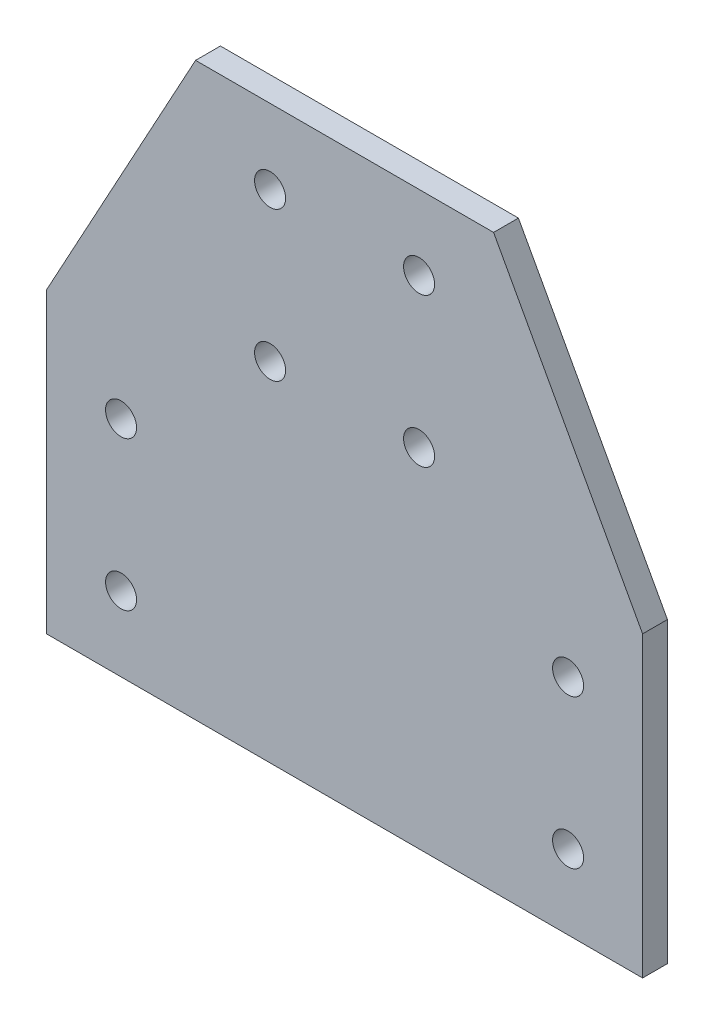
ISO-10303-21;
HEADER;
FILE_DESCRIPTION(('STEP AP214'),'2;1');
FILE_NAME('part.step','',(''),(''),'','','');
FILE_SCHEMA(('AUTOMOTIVE_DESIGN { 1 0 10303 214 1 1 1 1 }'));
ENDSEC;
DATA;
#1=APPLICATION_CONTEXT('core data for automotive mechanical design processes');
#2=APPLICATION_PROTOCOL_DEFINITION('international standard','automotive_design',2000,#1);
#3=PRODUCT_CONTEXT('',#1,'mechanical');
#4=PRODUCT('Part','Part','',(#3));
#5=PRODUCT_RELATED_PRODUCT_CATEGORY('part','',(#4));
#6=PRODUCT_DEFINITION_FORMATION('','',#4);
#7=PRODUCT_DEFINITION_CONTEXT('part definition',#1,'design');
#8=PRODUCT_DEFINITION('design','',#6,#7);
#9=PRODUCT_DEFINITION_SHAPE('','',#8);
#10=(LENGTH_UNIT() NAMED_UNIT(*) SI_UNIT(.MILLI.,.METRE.));
#11=(NAMED_UNIT(*) PLANE_ANGLE_UNIT() SI_UNIT($,.RADIAN.));
#12=(NAMED_UNIT(*) SI_UNIT($,.STERADIAN.) SOLID_ANGLE_UNIT());
#13=UNCERTAINTY_MEASURE_WITH_UNIT(LENGTH_MEASURE(1.E-05),#10,'distance_accuracy_value','');
#14=(GEOMETRIC_REPRESENTATION_CONTEXT(3) GLOBAL_UNCERTAINTY_ASSIGNED_CONTEXT((#13)) GLOBAL_UNIT_ASSIGNED_CONTEXT((#10,
#11,#12)) REPRESENTATION_CONTEXT('',''));
#15=CARTESIAN_POINT('',(0.,0.,0.));
#16=DIRECTION('',(0.,0.,1.));
#17=DIRECTION('',(1.,0.,0.));
#18=AXIS2_PLACEMENT_3D('',#15,#16,#17);
#19=CARTESIAN_POINT('',(0.,0.,6.35));
#20=DIRECTION('',(0.,-1.,0.));
#21=DIRECTION('',(0.,0.,-1.));
#22=AXIS2_PLACEMENT_3D('',#19,#20,#21);
#23=PLANE('',#22);
#24=DIRECTION('',(-1.,0.,0.));
#25=VECTOR('',#24,1.);
#26=CARTESIAN_POINT('',(0.,0.,0.));
#27=LINE('',#26,#25);
#28=CARTESIAN_POINT('',(152.4,0.,0.));
#29=VERTEX_POINT('',#28);
#30=CARTESIAN_POINT('',(0.,0.,0.));
#31=VERTEX_POINT('',#30);
#32=EDGE_CURVE('E120',#29,#31,#27,.T.);
#33=ORIENTED_EDGE('',*,*,#32,.F.);
#34=DIRECTION('',(0.,0.,-1.));
#35=VECTOR('',#34,1.);
#36=CARTESIAN_POINT('',(152.4,0.,6.35));
#37=LINE('',#36,#35);
#38=CARTESIAN_POINT('',(152.4,0.,6.35));
#39=VERTEX_POINT('',#38);
#40=EDGE_CURVE('E11',#39,#29,#37,.T.);
#41=ORIENTED_EDGE('',*,*,#40,.F.);
#42=DIRECTION('',(-1.,0.,0.));
#43=VECTOR('',#42,1.);
#44=CARTESIAN_POINT('',(0.,0.,6.35));
#45=LINE('',#44,#43);
#46=CARTESIAN_POINT('',(0.,0.,6.35));
#47=VERTEX_POINT('',#46);
#48=EDGE_CURVE('E132',#39,#47,#45,.T.);
#49=ORIENTED_EDGE('',*,*,#48,.T.);
#50=DIRECTION('',(0.,0.,-1.));
#51=VECTOR('',#50,1.);
#52=CARTESIAN_POINT('',(0.,0.,6.35));
#53=LINE('',#52,#51);
#54=EDGE_CURVE('E84',#47,#31,#53,.T.);
#55=ORIENTED_EDGE('',*,*,#54,.T.);
#56=EDGE_LOOP('',(#33,#41,#49,#55));
#57=FACE_BOUND('',#56,.T.);
#58=ADVANCED_FACE('F39',(#57),#23,.T.);
#59=CARTESIAN_POINT('',(152.4,0.,6.35));
#60=DIRECTION('',(-1.,0.,0.));
#61=DIRECTION('',(0.,0.,1.));
#62=AXIS2_PLACEMENT_3D('',#59,#60,#61);
#63=PLANE('',#62);
#64=DIRECTION('',(0.,1.,0.));
#65=VECTOR('',#64,1.);
#66=CARTESIAN_POINT('',(152.4,0.,0.));
#67=LINE('',#66,#65);
#68=CARTESIAN_POINT('',(152.4,76.2,0.));
#69=VERTEX_POINT('',#68);
#70=EDGE_CURVE('E123',#29,#69,#67,.T.);
#71=ORIENTED_EDGE('',*,*,#70,.T.);
#72=DIRECTION('',(0.,0.,-1.));
#73=VECTOR('',#72,1.);
#74=CARTESIAN_POINT('',(152.4,76.2,6.35));
#75=LINE('',#74,#73);
#76=CARTESIAN_POINT('',(152.4,76.2,6.35));
#77=VERTEX_POINT('',#76);
#78=EDGE_CURVE('E47',#77,#69,#75,.T.);
#79=ORIENTED_EDGE('',*,*,#78,.F.);
#80=DIRECTION('',(0.,1.,0.));
#81=VECTOR('',#80,1.);
#82=CARTESIAN_POINT('',(152.4,0.,6.35));
#83=LINE('',#82,#81);
#84=EDGE_CURVE('E147',#39,#77,#83,.T.);
#85=ORIENTED_EDGE('',*,*,#84,.F.);
#86=ORIENTED_EDGE('',*,*,#40,.T.);
#87=EDGE_LOOP('',(#71,#79,#85,#86));
#88=FACE_BOUND('',#87,.T.);
#89=ADVANCED_FACE('F234',(#88),#63,.F.);
#90=CARTESIAN_POINT('',(149.487898089172,81.5388535031846,6.35));
#91=DIRECTION('',(-0.877895572914385,-0.478852130680573,0.));
#92=DIRECTION('',(0.478852130680573,-0.877895572914385,0.));
#93=AXIS2_PLACEMENT_3D('',#90,#91,#92);
#94=PLANE('',#93);
#95=DIRECTION('',(-0.478852130680573,0.877895572914385,0.));
#96=VECTOR('',#95,1.);
#97=CARTESIAN_POINT('',(149.487898089172,81.5388535031846,0.));
#98=LINE('',#97,#96);
#99=CARTESIAN_POINT('',(114.3,146.05,0.));
#100=VERTEX_POINT('',#99);
#101=EDGE_CURVE('E126',#69,#100,#98,.T.);
#102=ORIENTED_EDGE('',*,*,#101,.T.);
#103=DIRECTION('',(0.,0.,-1.));
#104=VECTOR('',#103,1.);
#105=CARTESIAN_POINT('',(114.3,146.05,6.35));
#106=LINE('',#105,#104);
#107=CARTESIAN_POINT('',(114.3,146.05,6.35));
#108=VERTEX_POINT('',#107);
#109=EDGE_CURVE('E112',#108,#100,#106,.T.);
#110=ORIENTED_EDGE('',*,*,#109,.F.);
#111=DIRECTION('',(-0.478852130680573,0.877895572914385,0.));
#112=VECTOR('',#111,1.);
#113=CARTESIAN_POINT('',(149.487898089172,81.5388535031846,6.35));
#114=LINE('',#113,#112);
#115=EDGE_CURVE('E103',#77,#108,#114,.T.);
#116=ORIENTED_EDGE('',*,*,#115,.F.);
#117=ORIENTED_EDGE('',*,*,#78,.T.);
#118=EDGE_LOOP('',(#102,#110,#116,#117));
#119=FACE_BOUND('',#118,.T.);
#120=ADVANCED_FACE('F139',(#119),#94,.F.);
#121=CARTESIAN_POINT('',(0.,146.05,6.35));
#122=DIRECTION('',(0.,-1.,0.));
#123=DIRECTION('',(0.,0.,-1.));
#124=AXIS2_PLACEMENT_3D('',#121,#122,#123);
#125=PLANE('',#124);
#126=DIRECTION('',(-1.,0.,0.));
#127=VECTOR('',#126,1.);
#128=CARTESIAN_POINT('',(0.,146.05,0.));
#129=LINE('',#128,#127);
#130=CARTESIAN_POINT('',(38.1,146.05,0.));
#131=VERTEX_POINT('',#130);
#132=EDGE_CURVE('E111',#100,#131,#129,.T.);
#133=ORIENTED_EDGE('',*,*,#132,.T.);
#134=DIRECTION('',(0.,0.,-1.));
#135=VECTOR('',#134,1.);
#136=CARTESIAN_POINT('',(38.1,146.05,6.35));
#137=LINE('',#136,#135);
#138=CARTESIAN_POINT('',(38.1,146.05,6.35));
#139=VERTEX_POINT('',#138);
#140=EDGE_CURVE('E108',#139,#131,#137,.T.);
#141=ORIENTED_EDGE('',*,*,#140,.F.);
#142=DIRECTION('',(-1.,0.,0.));
#143=VECTOR('',#142,1.);
#144=CARTESIAN_POINT('',(0.,146.05,6.35));
#145=LINE('',#144,#143);
#146=EDGE_CURVE('E97',#108,#139,#145,.T.);
#147=ORIENTED_EDGE('',*,*,#146,.F.);
#148=ORIENTED_EDGE('',*,*,#109,.T.);
#149=EDGE_LOOP('',(#133,#141,#147,#148));
#150=FACE_BOUND('',#149,.T.);
#151=ADVANCED_FACE('F109',(#150),#125,.F.);
#152=CARTESIAN_POINT('',(-32.0331210191083,17.4726114649681,6.35));
#153=DIRECTION('',(0.877895572914384,-0.478852130680573,0.));
#154=DIRECTION('',(0.478852130680573,0.877895572914385,0.));
#155=AXIS2_PLACEMENT_3D('',#152,#153,#154);
#156=PLANE('',#155);
#157=DIRECTION('',(-0.478852130680573,-0.877895572914385,0.));
#158=VECTOR('',#157,1.);
#159=CARTESIAN_POINT('',(-32.0331210191083,17.4726114649681,0.));
#160=LINE('',#159,#158);
#161=CARTESIAN_POINT('',(0.,76.2,0.));
#162=VERTEX_POINT('',#161);
#163=EDGE_CURVE('E77',#131,#162,#160,.T.);
#164=ORIENTED_EDGE('',*,*,#163,.T.);
#165=DIRECTION('',(0.,0.,-1.));
#166=VECTOR('',#165,1.);
#167=CARTESIAN_POINT('',(0.,76.2,6.35));
#168=LINE('',#167,#166);
#169=CARTESIAN_POINT('',(0.,76.2,6.35));
#170=VERTEX_POINT('',#169);
#171=EDGE_CURVE('E113',#170,#162,#168,.T.);
#172=ORIENTED_EDGE('',*,*,#171,.F.);
#173=DIRECTION('',(-0.478852130680573,-0.877895572914385,0.));
#174=VECTOR('',#173,1.);
#175=CARTESIAN_POINT('',(-32.0331210191083,17.4726114649681,6.35));
#176=LINE('',#175,#174);
#177=EDGE_CURVE('E101',#139,#170,#176,.T.);
#178=ORIENTED_EDGE('',*,*,#177,.F.);
#179=ORIENTED_EDGE('',*,*,#140,.T.);
#180=EDGE_LOOP('',(#164,#172,#178,#179));
#181=FACE_BOUND('',#180,.T.);
#182=ADVANCED_FACE('F115',(#181),#156,.F.);
#183=CARTESIAN_POINT('',(0.,0.,6.35));
#184=DIRECTION('',(1.,0.,0.));
#185=DIRECTION('',(0.,1.,0.));
#186=AXIS2_PLACEMENT_3D('',#183,#184,#185);
#187=PLANE('',#186);
#188=DIRECTION('',(0.,-1.,0.));
#189=VECTOR('',#188,1.);
#190=CARTESIAN_POINT('',(0.,0.,0.));
#191=LINE('',#190,#189);
#192=EDGE_CURVE('E130',#162,#31,#191,.T.);
#193=ORIENTED_EDGE('',*,*,#192,.T.);
#194=ORIENTED_EDGE('',*,*,#54,.F.);
#195=DIRECTION('',(0.,-1.,0.));
#196=VECTOR('',#195,1.);
#197=CARTESIAN_POINT('',(0.,0.,6.35));
#198=LINE('',#197,#196);
#199=EDGE_CURVE('E55',#170,#47,#198,.T.);
#200=ORIENTED_EDGE('',*,*,#199,.F.);
#201=ORIENTED_EDGE('',*,*,#171,.T.);
#202=EDGE_LOOP('',(#193,#194,#200,#201));
#203=FACE_BOUND('',#202,.T.);
#204=ADVANCED_FACE('F146',(#203),#187,.F.);
#205=CARTESIAN_POINT('',(0.,0.,6.35));
#206=DIRECTION('',(0.,0.,1.));
#207=DIRECTION('',(1.,0.,0.));
#208=AXIS2_PLACEMENT_3D('',#205,#206,#207);
#209=PLANE('',#208);
#210=CARTESIAN_POINT('',(19.05,19.05,6.35));
#211=DIRECTION('',(0.,0.,1.));
#212=DIRECTION('',(1.,0.,0.));
#213=AXIS2_PLACEMENT_3D('',#210,#211,#212);
#214=CIRCLE('',#213,3.96874999999999);
#215=CARTESIAN_POINT('',(23.01875,19.05,6.35));
#216=VERTEX_POINT('',#215);
#217=EDGE_CURVE('E195',#216,#216,#214,.T.);
#218=ORIENTED_EDGE('',*,*,#217,.F.);
#219=EDGE_LOOP('',(#218));
#220=FACE_BOUND('',#219,.T.);
#221=CARTESIAN_POINT('',(19.05,57.15,6.35));
#222=DIRECTION('',(0.,0.,1.));
#223=DIRECTION('',(1.,0.,0.));
#224=AXIS2_PLACEMENT_3D('',#221,#222,#223);
#225=CIRCLE('',#224,3.96874999999999);
#226=CARTESIAN_POINT('',(23.01875,57.15,6.35));
#227=VERTEX_POINT('',#226);
#228=EDGE_CURVE('E189',#227,#227,#225,.T.);
#229=ORIENTED_EDGE('',*,*,#228,.F.);
#230=EDGE_LOOP('',(#229));
#231=FACE_BOUND('',#230,.T.);
#232=CARTESIAN_POINT('',(57.15,88.9,6.35));
#233=DIRECTION('',(0.,0.,1.));
#234=DIRECTION('',(1.,0.,0.));
#235=AXIS2_PLACEMENT_3D('',#232,#233,#234);
#236=CIRCLE('',#235,3.96874999999999);
#237=CARTESIAN_POINT('',(61.11875,88.9,6.35));
#238=VERTEX_POINT('',#237);
#239=EDGE_CURVE('E183',#238,#238,#236,.T.);
#240=ORIENTED_EDGE('',*,*,#239,.F.);
#241=EDGE_LOOP('',(#240));
#242=FACE_BOUND('',#241,.T.);
#243=CARTESIAN_POINT('',(57.15,127.,6.35));
#244=DIRECTION('',(0.,0.,1.));
#245=DIRECTION('',(1.,0.,0.));
#246=AXIS2_PLACEMENT_3D('',#243,#244,#245);
#247=CIRCLE('',#246,3.96874999999999);
#248=CARTESIAN_POINT('',(61.11875,127.,6.35));
#249=VERTEX_POINT('',#248);
#250=EDGE_CURVE('E177',#249,#249,#247,.T.);
#251=ORIENTED_EDGE('',*,*,#250,.F.);
#252=EDGE_LOOP('',(#251));
#253=FACE_BOUND('',#252,.T.);
#254=CARTESIAN_POINT('',(95.25,127.,6.35));
#255=DIRECTION('',(0.,0.,1.));
#256=DIRECTION('',(1.,0.,0.));
#257=AXIS2_PLACEMENT_3D('',#254,#255,#256);
#258=CIRCLE('',#257,3.96874999999999);
#259=CARTESIAN_POINT('',(99.21875,127.,6.35));
#260=VERTEX_POINT('',#259);
#261=EDGE_CURVE('E171',#260,#260,#258,.T.);
#262=ORIENTED_EDGE('',*,*,#261,.F.);
#263=EDGE_LOOP('',(#262));
#264=FACE_BOUND('',#263,.T.);
#265=CARTESIAN_POINT('',(95.25,88.9,6.35));
#266=DIRECTION('',(0.,0.,1.));
#267=DIRECTION('',(1.,0.,0.));
#268=AXIS2_PLACEMENT_3D('',#265,#266,#267);
#269=CIRCLE('',#268,3.96874999999999);
#270=CARTESIAN_POINT('',(99.21875,88.9,6.35));
#271=VERTEX_POINT('',#270);
#272=EDGE_CURVE('E165',#271,#271,#269,.T.);
#273=ORIENTED_EDGE('',*,*,#272,.F.);
#274=EDGE_LOOP('',(#273));
#275=FACE_BOUND('',#274,.T.);
#276=CARTESIAN_POINT('',(133.35,57.15,6.35));
#277=DIRECTION('',(0.,0.,1.));
#278=DIRECTION('',(1.,0.,0.));
#279=AXIS2_PLACEMENT_3D('',#276,#277,#278);
#280=CIRCLE('',#279,3.96874999999999);
#281=CARTESIAN_POINT('',(137.31875,57.15,6.35));
#282=VERTEX_POINT('',#281);
#283=EDGE_CURVE('E159',#282,#282,#280,.T.);
#284=ORIENTED_EDGE('',*,*,#283,.F.);
#285=EDGE_LOOP('',(#284));
#286=FACE_BOUND('',#285,.T.);
#287=CARTESIAN_POINT('',(133.35,19.05,6.35));
#288=DIRECTION('',(0.,0.,1.));
#289=DIRECTION('',(1.,0.,0.));
#290=AXIS2_PLACEMENT_3D('',#287,#288,#289);
#291=CIRCLE('',#290,3.96874999999999);
#292=CARTESIAN_POINT('',(137.31875,19.05,6.35));
#293=VERTEX_POINT('',#292);
#294=EDGE_CURVE('E153',#293,#293,#291,.T.);
#295=ORIENTED_EDGE('',*,*,#294,.F.);
#296=EDGE_LOOP('',(#295));
#297=FACE_BOUND('',#296,.T.);
#298=ORIENTED_EDGE('',*,*,#48,.F.);
#299=ORIENTED_EDGE('',*,*,#84,.T.);
#300=ORIENTED_EDGE('',*,*,#115,.T.);
#301=ORIENTED_EDGE('',*,*,#146,.T.);
#302=ORIENTED_EDGE('',*,*,#177,.T.);
#303=ORIENTED_EDGE('',*,*,#199,.T.);
#304=EDGE_LOOP('',(#298,#299,#300,#301,#302,#303));
#305=FACE_BOUND('',#304,.T.);
#306=ADVANCED_FACE('F99',(#220,#231,#242,#253,#264,#275,#286,#297,#305),#209,.T.);
#307=CARTESIAN_POINT('',(0.,0.,0.));
#308=DIRECTION('',(0.,0.,1.));
#309=DIRECTION('',(1.,0.,0.));
#310=AXIS2_PLACEMENT_3D('',#307,#308,#309);
#311=PLANE('',#310);
#312=CARTESIAN_POINT('',(19.05,19.05,0.));
#313=DIRECTION('',(0.,0.,1.));
#314=DIRECTION('',(1.,0.,0.));
#315=AXIS2_PLACEMENT_3D('',#312,#313,#314);
#316=CIRCLE('',#315,3.96875);
#317=CARTESIAN_POINT('',(23.01875,19.05,0.));
#318=VERTEX_POINT('',#317);
#319=EDGE_CURVE('E192',#318,#318,#316,.T.);
#320=ORIENTED_EDGE('',*,*,#319,.T.);
#321=EDGE_LOOP('',(#320));
#322=FACE_BOUND('',#321,.T.);
#323=CARTESIAN_POINT('',(19.05,57.15,0.));
#324=DIRECTION('',(0.,0.,1.));
#325=DIRECTION('',(1.,0.,0.));
#326=AXIS2_PLACEMENT_3D('',#323,#324,#325);
#327=CIRCLE('',#326,3.96875);
#328=CARTESIAN_POINT('',(23.01875,57.15,0.));
#329=VERTEX_POINT('',#328);
#330=EDGE_CURVE('E186',#329,#329,#327,.T.);
#331=ORIENTED_EDGE('',*,*,#330,.T.);
#332=EDGE_LOOP('',(#331));
#333=FACE_BOUND('',#332,.T.);
#334=CARTESIAN_POINT('',(57.15,88.9,0.));
#335=DIRECTION('',(0.,0.,1.));
#336=DIRECTION('',(1.,0.,0.));
#337=AXIS2_PLACEMENT_3D('',#334,#335,#336);
#338=CIRCLE('',#337,3.96875);
#339=CARTESIAN_POINT('',(61.11875,88.9,0.));
#340=VERTEX_POINT('',#339);
#341=EDGE_CURVE('E180',#340,#340,#338,.T.);
#342=ORIENTED_EDGE('',*,*,#341,.T.);
#343=EDGE_LOOP('',(#342));
#344=FACE_BOUND('',#343,.T.);
#345=CARTESIAN_POINT('',(57.15,127.,0.));
#346=DIRECTION('',(0.,0.,1.));
#347=DIRECTION('',(1.,0.,0.));
#348=AXIS2_PLACEMENT_3D('',#345,#346,#347);
#349=CIRCLE('',#348,3.96875);
#350=CARTESIAN_POINT('',(61.11875,127.,0.));
#351=VERTEX_POINT('',#350);
#352=EDGE_CURVE('E174',#351,#351,#349,.T.);
#353=ORIENTED_EDGE('',*,*,#352,.T.);
#354=EDGE_LOOP('',(#353));
#355=FACE_BOUND('',#354,.T.);
#356=CARTESIAN_POINT('',(95.25,127.,0.));
#357=DIRECTION('',(0.,0.,1.));
#358=DIRECTION('',(1.,0.,0.));
#359=AXIS2_PLACEMENT_3D('',#356,#357,#358);
#360=CIRCLE('',#359,3.96874999999999);
#361=CARTESIAN_POINT('',(99.21875,127.,0.));
#362=VERTEX_POINT('',#361);
#363=EDGE_CURVE('E168',#362,#362,#360,.T.);
#364=ORIENTED_EDGE('',*,*,#363,.T.);
#365=EDGE_LOOP('',(#364));
#366=FACE_BOUND('',#365,.T.);
#367=CARTESIAN_POINT('',(95.25,88.9,0.));
#368=DIRECTION('',(0.,0.,1.));
#369=DIRECTION('',(1.,0.,0.));
#370=AXIS2_PLACEMENT_3D('',#367,#368,#369);
#371=CIRCLE('',#370,3.96874999999999);
#372=CARTESIAN_POINT('',(99.21875,88.9,0.));
#373=VERTEX_POINT('',#372);
#374=EDGE_CURVE('E162',#373,#373,#371,.T.);
#375=ORIENTED_EDGE('',*,*,#374,.T.);
#376=EDGE_LOOP('',(#375));
#377=FACE_BOUND('',#376,.T.);
#378=CARTESIAN_POINT('',(133.35,57.15,0.));
#379=DIRECTION('',(0.,0.,1.));
#380=DIRECTION('',(1.,0.,0.));
#381=AXIS2_PLACEMENT_3D('',#378,#379,#380);
#382=CIRCLE('',#381,3.96874999999999);
#383=CARTESIAN_POINT('',(137.31875,57.15,0.));
#384=VERTEX_POINT('',#383);
#385=EDGE_CURVE('E156',#384,#384,#382,.T.);
#386=ORIENTED_EDGE('',*,*,#385,.T.);
#387=EDGE_LOOP('',(#386));
#388=FACE_BOUND('',#387,.T.);
#389=CARTESIAN_POINT('',(133.35,19.05,0.));
#390=DIRECTION('',(0.,0.,1.));
#391=DIRECTION('',(1.,0.,0.));
#392=AXIS2_PLACEMENT_3D('',#389,#390,#391);
#393=CIRCLE('',#392,3.96874999999999);
#394=CARTESIAN_POINT('',(137.31875,19.05,0.));
#395=VERTEX_POINT('',#394);
#396=EDGE_CURVE('E124',#395,#395,#393,.T.);
#397=ORIENTED_EDGE('',*,*,#396,.T.);
#398=EDGE_LOOP('',(#397));
#399=FACE_BOUND('',#398,.T.);
#400=ORIENTED_EDGE('',*,*,#32,.T.);
#401=ORIENTED_EDGE('',*,*,#192,.F.);
#402=ORIENTED_EDGE('',*,*,#163,.F.);
#403=ORIENTED_EDGE('',*,*,#132,.F.);
#404=ORIENTED_EDGE('',*,*,#101,.F.);
#405=ORIENTED_EDGE('',*,*,#70,.F.);
#406=EDGE_LOOP('',(#400,#401,#402,#403,#404,#405));
#407=FACE_BOUND('',#406,.T.);
#408=ADVANCED_FACE('F143',(#322,#333,#344,#355,#366,#377,#388,#399,#407),#311,.F.);
#409=CARTESIAN_POINT('',(133.35,19.05,6.35));
#410=DIRECTION('',(0.,0.,1.));
#411=DIRECTION('',(1.,0.,0.));
#412=AXIS2_PLACEMENT_3D('',#409,#410,#411);
#413=CYLINDRICAL_SURFACE('',#412,3.96874999999999);
#414=ORIENTED_EDGE('',*,*,#396,.F.);
#415=EDGE_LOOP('',(#414));
#416=FACE_BOUND('',#415,.T.);
#417=ORIENTED_EDGE('',*,*,#294,.T.);
#418=EDGE_LOOP('',(#417));
#419=FACE_BOUND('',#418,.T.);
#420=ADVANCED_FACE('F218',(#416,#419),#413,.F.);
#421=CARTESIAN_POINT('',(133.35,57.15,6.35));
#422=DIRECTION('',(0.,0.,1.));
#423=DIRECTION('',(1.,0.,0.));
#424=AXIS2_PLACEMENT_3D('',#421,#422,#423);
#425=CYLINDRICAL_SURFACE('',#424,3.96874999999999);
#426=ORIENTED_EDGE('',*,*,#385,.F.);
#427=EDGE_LOOP('',(#426));
#428=FACE_BOUND('',#427,.T.);
#429=ORIENTED_EDGE('',*,*,#283,.T.);
#430=EDGE_LOOP('',(#429));
#431=FACE_BOUND('',#430,.T.);
#432=ADVANCED_FACE('F220',(#428,#431),#425,.F.);
#433=CARTESIAN_POINT('',(95.25,88.9,6.35));
#434=DIRECTION('',(0.,0.,1.));
#435=DIRECTION('',(1.,0.,0.));
#436=AXIS2_PLACEMENT_3D('',#433,#434,#435);
#437=CYLINDRICAL_SURFACE('',#436,3.96874999999999);
#438=ORIENTED_EDGE('',*,*,#374,.F.);
#439=EDGE_LOOP('',(#438));
#440=FACE_BOUND('',#439,.T.);
#441=ORIENTED_EDGE('',*,*,#272,.T.);
#442=EDGE_LOOP('',(#441));
#443=FACE_BOUND('',#442,.T.);
#444=ADVANCED_FACE('F227',(#440,#443),#437,.F.);
#445=CARTESIAN_POINT('',(95.25,127.,6.35));
#446=DIRECTION('',(0.,0.,1.));
#447=DIRECTION('',(1.,0.,0.));
#448=AXIS2_PLACEMENT_3D('',#445,#446,#447);
#449=CYLINDRICAL_SURFACE('',#448,3.96874999999999);
#450=ORIENTED_EDGE('',*,*,#363,.F.);
#451=EDGE_LOOP('',(#450));
#452=FACE_BOUND('',#451,.T.);
#453=ORIENTED_EDGE('',*,*,#261,.T.);
#454=EDGE_LOOP('',(#453));
#455=FACE_BOUND('',#454,.T.);
#456=ADVANCED_FACE('F279',(#452,#455),#449,.F.);
#457=CARTESIAN_POINT('',(57.15,127.,6.35));
#458=DIRECTION('',(0.,0.,1.));
#459=DIRECTION('',(1.,0.,0.));
#460=AXIS2_PLACEMENT_3D('',#457,#458,#459);
#461=CYLINDRICAL_SURFACE('',#460,3.96874999999999);
#462=ORIENTED_EDGE('',*,*,#352,.F.);
#463=EDGE_LOOP('',(#462));
#464=FACE_BOUND('',#463,.T.);
#465=ORIENTED_EDGE('',*,*,#250,.T.);
#466=EDGE_LOOP('',(#465));
#467=FACE_BOUND('',#466,.T.);
#468=ADVANCED_FACE('F289',(#464,#467),#461,.F.);
#469=CARTESIAN_POINT('',(57.15,88.9,6.35));
#470=DIRECTION('',(0.,0.,1.));
#471=DIRECTION('',(1.,0.,0.));
#472=AXIS2_PLACEMENT_3D('',#469,#470,#471);
#473=CYLINDRICAL_SURFACE('',#472,3.96874999999999);
#474=ORIENTED_EDGE('',*,*,#341,.F.);
#475=EDGE_LOOP('',(#474));
#476=FACE_BOUND('',#475,.T.);
#477=ORIENTED_EDGE('',*,*,#239,.T.);
#478=EDGE_LOOP('',(#477));
#479=FACE_BOUND('',#478,.T.);
#480=ADVANCED_FACE('F299',(#476,#479),#473,.F.);
#481=CARTESIAN_POINT('',(19.05,57.15,6.35));
#482=DIRECTION('',(0.,0.,1.));
#483=DIRECTION('',(1.,0.,0.));
#484=AXIS2_PLACEMENT_3D('',#481,#482,#483);
#485=CYLINDRICAL_SURFACE('',#484,3.96874999999999);
#486=ORIENTED_EDGE('',*,*,#330,.F.);
#487=EDGE_LOOP('',(#486));
#488=FACE_BOUND('',#487,.T.);
#489=ORIENTED_EDGE('',*,*,#228,.T.);
#490=EDGE_LOOP('',(#489));
#491=FACE_BOUND('',#490,.T.);
#492=ADVANCED_FACE('F309',(#488,#491),#485,.F.);
#493=CARTESIAN_POINT('',(19.05,19.05,6.35));
#494=DIRECTION('',(0.,0.,1.));
#495=DIRECTION('',(1.,0.,0.));
#496=AXIS2_PLACEMENT_3D('',#493,#494,#495);
#497=CYLINDRICAL_SURFACE('',#496,3.96874999999999);
#498=ORIENTED_EDGE('',*,*,#319,.F.);
#499=EDGE_LOOP('',(#498));
#500=FACE_BOUND('',#499,.T.);
#501=ORIENTED_EDGE('',*,*,#217,.T.);
#502=EDGE_LOOP('',(#501));
#503=FACE_BOUND('',#502,.T.);
#504=ADVANCED_FACE('F199',(#500,#503),#497,.F.);
#505=CLOSED_SHELL('',(#58,#89,#120,#151,#182,#204,#306,#408,#420,#432,#444,#456,#468,#480,#492,#504));
#506=MANIFOLD_SOLID_BREP('B2',#505);
#507=ADVANCED_BREP_SHAPE_REPRESENTATION('',(#18,#506),#14);
#508=SHAPE_DEFINITION_REPRESENTATION(#9,#507);
ENDSEC;
END-ISO-10303-21;
